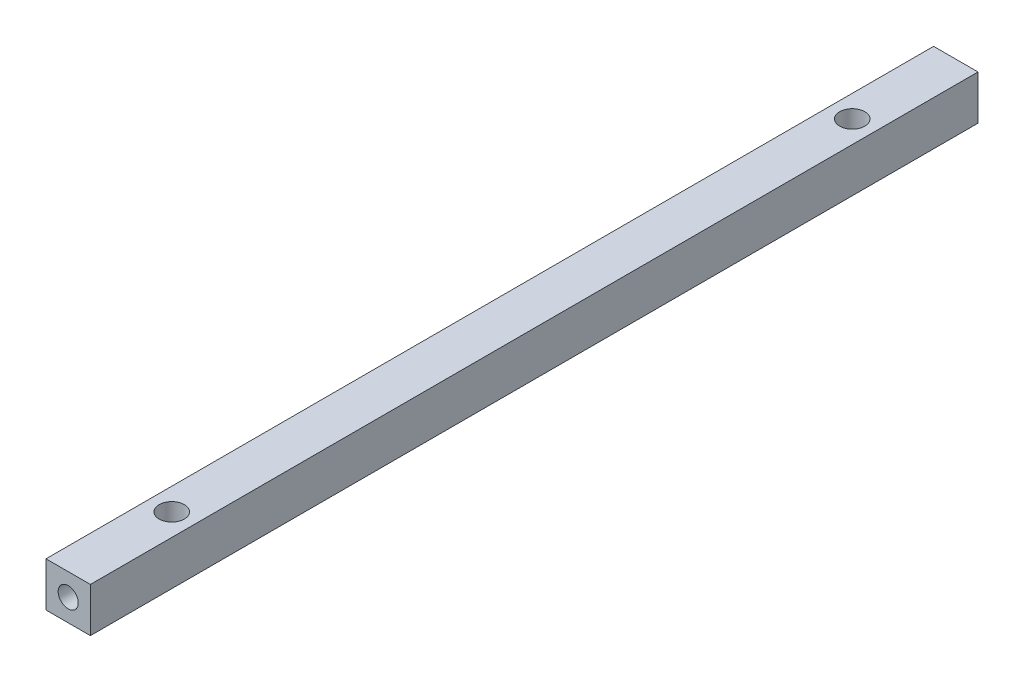
ISO-10303-21;
HEADER;
FILE_DESCRIPTION(('STEP AP214'),'2;1');
FILE_NAME('part.step','',(''),(''),'','','');
FILE_SCHEMA(('AUTOMOTIVE_DESIGN { 1 0 10303 214 1 1 1 1 }'));
ENDSEC;
DATA;
#1=APPLICATION_CONTEXT('core data for automotive mechanical design processes');
#2=APPLICATION_PROTOCOL_DEFINITION('international standard','automotive_design',2000,#1);
#3=PRODUCT_CONTEXT('',#1,'mechanical');
#4=PRODUCT('Part','Part','',(#3));
#5=PRODUCT_RELATED_PRODUCT_CATEGORY('part','',(#4));
#6=PRODUCT_DEFINITION_FORMATION('','',#4);
#7=PRODUCT_DEFINITION_CONTEXT('part definition',#1,'design');
#8=PRODUCT_DEFINITION('design','',#6,#7);
#9=PRODUCT_DEFINITION_SHAPE('','',#8);
#10=(LENGTH_UNIT() NAMED_UNIT(*) SI_UNIT(.MILLI.,.METRE.));
#11=(NAMED_UNIT(*) PLANE_ANGLE_UNIT() SI_UNIT($,.RADIAN.));
#12=(NAMED_UNIT(*) SI_UNIT($,.STERADIAN.) SOLID_ANGLE_UNIT());
#13=UNCERTAINTY_MEASURE_WITH_UNIT(LENGTH_MEASURE(1.E-05),#10,'distance_accuracy_value','');
#14=(GEOMETRIC_REPRESENTATION_CONTEXT(3) GLOBAL_UNCERTAINTY_ASSIGNED_CONTEXT((#13)) GLOBAL_UNIT_ASSIGNED_CONTEXT((#10,
#11,#12)) REPRESENTATION_CONTEXT('',''));
#15=CARTESIAN_POINT('',(0.,0.,0.));
#16=DIRECTION('',(0.,0.,1.));
#17=DIRECTION('',(1.,0.,0.));
#18=AXIS2_PLACEMENT_3D('',#15,#16,#17);
#19=CARTESIAN_POINT('',(7.5,-7.5,150.));
#20=DIRECTION('',(-1.,0.,0.));
#21=DIRECTION('',(0.,0.,1.));
#22=AXIS2_PLACEMENT_3D('',#19,#20,#21);
#23=PLANE('',#22);
#24=DIRECTION('',(0.,1.,0.));
#25=VECTOR('',#24,1.);
#26=CARTESIAN_POINT('',(7.5,-7.5,-150.));
#27=LINE('',#26,#25);
#28=CARTESIAN_POINT('',(7.5,-7.5,-150.));
#29=VERTEX_POINT('',#28);
#30=CARTESIAN_POINT('',(7.5,7.5,-150.));
#31=VERTEX_POINT('',#30);
#32=EDGE_CURVE('E126',#29,#31,#27,.T.);
#33=ORIENTED_EDGE('',*,*,#32,.T.);
#34=DIRECTION('',(0.,0.,-1.));
#35=VECTOR('',#34,1.);
#36=CARTESIAN_POINT('',(7.5,7.5,150.));
#37=LINE('',#36,#35);
#38=CARTESIAN_POINT('',(7.5,7.5,150.));
#39=VERTEX_POINT('',#38);
#40=EDGE_CURVE('E11',#39,#31,#37,.T.);
#41=ORIENTED_EDGE('',*,*,#40,.F.);
#42=DIRECTION('',(0.,1.,0.));
#43=VECTOR('',#42,1.);
#44=CARTESIAN_POINT('',(7.5,-7.5,150.));
#45=LINE('',#44,#43);
#46=CARTESIAN_POINT('',(7.5,-7.5,150.));
#47=VERTEX_POINT('',#46);
#48=EDGE_CURVE('E127',#47,#39,#45,.T.);
#49=ORIENTED_EDGE('',*,*,#48,.F.);
#50=DIRECTION('',(0.,0.,-1.));
#51=VECTOR('',#50,1.);
#52=CARTESIAN_POINT('',(7.5,-7.5,150.));
#53=LINE('',#52,#51);
#54=EDGE_CURVE('E137',#47,#29,#53,.T.);
#55=ORIENTED_EDGE('',*,*,#54,.T.);
#56=EDGE_LOOP('',(#33,#41,#49,#55));
#57=FACE_BOUND('',#56,.T.);
#58=ADVANCED_FACE('F44',(#57),#23,.F.);
#59=CARTESIAN_POINT('',(-7.5,7.5,150.));
#60=DIRECTION('',(0.,-1.,0.));
#61=DIRECTION('',(0.,0.,-1.));
#62=AXIS2_PLACEMENT_3D('',#59,#60,#61);
#63=PLANE('',#62);
#64=CARTESIAN_POINT('',(0.,7.5,-115.));
#65=DIRECTION('',(0.,-1.,0.));
#66=DIRECTION('',(0.,0.,-1.));
#67=AXIS2_PLACEMENT_3D('',#64,#65,#66);
#68=CIRCLE('',#67,4.25000000000001);
#69=CARTESIAN_POINT('',(0.,7.5,-119.25));
#70=VERTEX_POINT('',#69);
#71=EDGE_CURVE('E189',#70,#70,#68,.T.);
#72=ORIENTED_EDGE('',*,*,#71,.T.);
#73=EDGE_LOOP('',(#72));
#74=FACE_BOUND('',#73,.T.);
#75=CARTESIAN_POINT('',(0.,7.5,115.));
#76=DIRECTION('',(0.,-1.,0.));
#77=DIRECTION('',(0.,0.,-1.));
#78=AXIS2_PLACEMENT_3D('',#75,#76,#77);
#79=CIRCLE('',#78,4.25000000000001);
#80=CARTESIAN_POINT('',(0.,7.5,110.75));
#81=VERTEX_POINT('',#80);
#82=EDGE_CURVE('E119',#81,#81,#79,.T.);
#83=ORIENTED_EDGE('',*,*,#82,.T.);
#84=EDGE_LOOP('',(#83));
#85=FACE_BOUND('',#84,.T.);
#86=DIRECTION('',(-1.,0.,0.));
#87=VECTOR('',#86,1.);
#88=CARTESIAN_POINT('',(-7.5,7.5,-150.));
#89=LINE('',#88,#87);
#90=CARTESIAN_POINT('',(-7.5,7.5,-150.));
#91=VERTEX_POINT('',#90);
#92=EDGE_CURVE('E141',#31,#91,#89,.T.);
#93=ORIENTED_EDGE('',*,*,#92,.T.);
#94=DIRECTION('',(0.,0.,-1.));
#95=VECTOR('',#94,1.);
#96=CARTESIAN_POINT('',(-7.5,7.5,150.));
#97=LINE('',#96,#95);
#98=CARTESIAN_POINT('',(-7.5,7.5,150.));
#99=VERTEX_POINT('',#98);
#100=EDGE_CURVE('E53',#99,#91,#97,.T.);
#101=ORIENTED_EDGE('',*,*,#100,.F.);
#102=DIRECTION('',(-1.,0.,0.));
#103=VECTOR('',#102,1.);
#104=CARTESIAN_POINT('',(-7.5,7.5,150.));
#105=LINE('',#104,#103);
#106=EDGE_CURVE('E92',#39,#99,#105,.T.);
#107=ORIENTED_EDGE('',*,*,#106,.F.);
#108=ORIENTED_EDGE('',*,*,#40,.T.);
#109=EDGE_LOOP('',(#93,#101,#107,#108));
#110=FACE_BOUND('',#109,.T.);
#111=ADVANCED_FACE('F174',(#74,#85,#110),#63,.F.);
#112=CARTESIAN_POINT('',(-7.5,-7.5,150.));
#113=DIRECTION('',(1.,0.,0.));
#114=DIRECTION('',(0.,0.,-1.));
#115=AXIS2_PLACEMENT_3D('',#112,#113,#114);
#116=PLANE('',#115);
#117=DIRECTION('',(0.,-1.,0.));
#118=VECTOR('',#117,1.);
#119=CARTESIAN_POINT('',(-7.5,-7.5,-150.));
#120=LINE('',#119,#118);
#121=CARTESIAN_POINT('',(-7.5,-7.5,-150.));
#122=VERTEX_POINT('',#121);
#123=EDGE_CURVE('E79',#91,#122,#120,.T.);
#124=ORIENTED_EDGE('',*,*,#123,.T.);
#125=DIRECTION('',(0.,0.,-1.));
#126=VECTOR('',#125,1.);
#127=CARTESIAN_POINT('',(-7.5,-7.5,150.));
#128=LINE('',#127,#126);
#129=CARTESIAN_POINT('',(-7.5,-7.5,150.));
#130=VERTEX_POINT('',#129);
#131=EDGE_CURVE('E150',#130,#122,#128,.T.);
#132=ORIENTED_EDGE('',*,*,#131,.F.);
#133=DIRECTION('',(0.,-1.,0.));
#134=VECTOR('',#133,1.);
#135=CARTESIAN_POINT('',(-7.5,-7.5,150.));
#136=LINE('',#135,#134);
#137=EDGE_CURVE('E132',#99,#130,#136,.T.);
#138=ORIENTED_EDGE('',*,*,#137,.F.);
#139=ORIENTED_EDGE('',*,*,#100,.T.);
#140=EDGE_LOOP('',(#124,#132,#138,#139));
#141=FACE_BOUND('',#140,.T.);
#142=ADVANCED_FACE('F154',(#141),#116,.F.);
#143=CARTESIAN_POINT('',(-7.5,-7.5,150.));
#144=DIRECTION('',(0.,1.,0.));
#145=DIRECTION('',(0.,0.,1.));
#146=AXIS2_PLACEMENT_3D('',#143,#144,#145);
#147=PLANE('',#146);
#148=CARTESIAN_POINT('',(0.,-7.5,-115.));
#149=DIRECTION('',(0.,-1.,0.));
#150=DIRECTION('',(0.,0.,-1.));
#151=AXIS2_PLACEMENT_3D('',#148,#149,#150);
#152=CIRCLE('',#151,7.00000000000001);
#153=CARTESIAN_POINT('',(0.,-7.5,-122.));
#154=VERTEX_POINT('',#153);
#155=EDGE_CURVE('E217',#154,#154,#152,.T.);
#156=ORIENTED_EDGE('',*,*,#155,.F.);
#157=EDGE_LOOP('',(#156));
#158=FACE_BOUND('',#157,.T.);
#159=CARTESIAN_POINT('',(0.,-7.5,115.));
#160=DIRECTION('',(0.,-1.,0.));
#161=DIRECTION('',(0.,0.,-1.));
#162=AXIS2_PLACEMENT_3D('',#159,#160,#161);
#163=CIRCLE('',#162,7.00000000000001);
#164=CARTESIAN_POINT('',(0.,-7.5,108.));
#165=VERTEX_POINT('',#164);
#166=EDGE_CURVE('E203',#165,#165,#163,.T.);
#167=ORIENTED_EDGE('',*,*,#166,.F.);
#168=EDGE_LOOP('',(#167));
#169=FACE_BOUND('',#168,.T.);
#170=DIRECTION('',(1.,0.,0.));
#171=VECTOR('',#170,1.);
#172=CARTESIAN_POINT('',(-7.5,-7.5,-150.));
#173=LINE('',#172,#171);
#174=EDGE_CURVE('E85',#122,#29,#173,.T.);
#175=ORIENTED_EDGE('',*,*,#174,.T.);
#176=ORIENTED_EDGE('',*,*,#54,.F.);
#177=DIRECTION('',(1.,0.,0.));
#178=VECTOR('',#177,1.);
#179=CARTESIAN_POINT('',(-7.5,-7.5,150.));
#180=LINE('',#179,#178);
#181=EDGE_CURVE('E61',#130,#47,#180,.T.);
#182=ORIENTED_EDGE('',*,*,#181,.F.);
#183=ORIENTED_EDGE('',*,*,#131,.T.);
#184=EDGE_LOOP('',(#175,#176,#182,#183));
#185=FACE_BOUND('',#184,.T.);
#186=ADVANCED_FACE('F161',(#158,#169,#185),#147,.F.);
#187=CARTESIAN_POINT('',(0.,0.,150.));
#188=DIRECTION('',(0.,0.,-1.));
#189=DIRECTION('',(-1.,0.,0.));
#190=AXIS2_PLACEMENT_3D('',#187,#188,#189);
#191=PLANE('',#190);
#192=CARTESIAN_POINT('',(0.,0.,150.));
#193=DIRECTION('',(0.,0.,1.));
#194=DIRECTION('',(1.,0.,0.));
#195=AXIS2_PLACEMENT_3D('',#192,#193,#194);
#196=CIRCLE('',#195,3.39999999999999);
#197=CARTESIAN_POINT('',(3.39999999999999,0.,150.));
#198=VERTEX_POINT('',#197);
#199=EDGE_CURVE('E110',#198,#198,#196,.T.);
#200=ORIENTED_EDGE('',*,*,#199,.F.);
#201=EDGE_LOOP('',(#200));
#202=FACE_BOUND('',#201,.T.);
#203=ORIENTED_EDGE('',*,*,#48,.T.);
#204=ORIENTED_EDGE('',*,*,#106,.T.);
#205=ORIENTED_EDGE('',*,*,#137,.T.);
#206=ORIENTED_EDGE('',*,*,#181,.T.);
#207=EDGE_LOOP('',(#203,#204,#205,#206));
#208=FACE_BOUND('',#207,.T.);
#209=ADVANCED_FACE('F163',(#202,#208),#191,.F.);
#210=CARTESIAN_POINT('',(0.,0.,-150.));
#211=DIRECTION('',(0.,0.,-1.));
#212=DIRECTION('',(-1.,0.,0.));
#213=AXIS2_PLACEMENT_3D('',#210,#211,#212);
#214=PLANE('',#213);
#215=CARTESIAN_POINT('',(0.,0.,-150.));
#216=DIRECTION('',(0.,0.,-1.));
#217=DIRECTION('',(-1.,0.,0.));
#218=AXIS2_PLACEMENT_3D('',#215,#216,#217);
#219=CIRCLE('',#218,3.39999999999999);
#220=CARTESIAN_POINT('',(-3.39999999999999,0.,-150.));
#221=VERTEX_POINT('',#220);
#222=EDGE_CURVE('E111',#221,#221,#219,.T.);
#223=ORIENTED_EDGE('',*,*,#222,.F.);
#224=EDGE_LOOP('',(#223));
#225=FACE_BOUND('',#224,.T.);
#226=ORIENTED_EDGE('',*,*,#32,.F.);
#227=ORIENTED_EDGE('',*,*,#174,.F.);
#228=ORIENTED_EDGE('',*,*,#123,.F.);
#229=ORIENTED_EDGE('',*,*,#92,.F.);
#230=EDGE_LOOP('',(#226,#227,#228,#229));
#231=FACE_BOUND('',#230,.T.);
#232=ADVANCED_FACE('F157',(#225,#231),#214,.T.);
#233=CARTESIAN_POINT('',(0.,0.,127.75));
#234=DIRECTION('',(0.,0.,1.));
#235=DIRECTION('',(1.,0.,0.));
#236=AXIS2_PLACEMENT_3D('',#233,#234,#235);
#237=CONICAL_SURFACE('',#236,3.39999999999999,1.02974425867665);
#238=CARTESIAN_POINT('',(0.,0.,125.707073895306));
#239=VERTEX_POINT('',#238);
#240=VERTEX_LOOP('',#239);
#241=FACE_BOUND('',#240,.T.);
#242=CARTESIAN_POINT('',(0.,0.,127.75));
#243=DIRECTION('',(0.,0.,1.));
#244=DIRECTION('',(1.,0.,0.));
#245=AXIS2_PLACEMENT_3D('',#242,#243,#244);
#246=CIRCLE('',#245,3.39999999999999);
#247=CARTESIAN_POINT('',(3.39999999999999,0.,127.75));
#248=VERTEX_POINT('',#247);
#249=EDGE_CURVE('E116',#248,#248,#246,.T.);
#250=ORIENTED_EDGE('',*,*,#249,.T.);
#251=EDGE_LOOP('',(#250));
#252=FACE_BOUND('',#251,.T.);
#253=ADVANCED_FACE('F252',(#241,#252),#237,.F.);
#254=CARTESIAN_POINT('',(0.,0.,150.));
#255=DIRECTION('',(0.,0.,1.));
#256=DIRECTION('',(1.,0.,0.));
#257=AXIS2_PLACEMENT_3D('',#254,#255,#256);
#258=CYLINDRICAL_SURFACE('',#257,3.39999999999999);
#259=ORIENTED_EDGE('',*,*,#249,.F.);
#260=EDGE_LOOP('',(#259));
#261=FACE_BOUND('',#260,.T.);
#262=ORIENTED_EDGE('',*,*,#199,.T.);
#263=EDGE_LOOP('',(#262));
#264=FACE_BOUND('',#263,.T.);
#265=ADVANCED_FACE('F103',(#261,#264),#258,.F.);
#266=CARTESIAN_POINT('',(0.,0.,-127.75));
#267=DIRECTION('',(0.,0.,-1.));
#268=DIRECTION('',(-1.,0.,0.));
#269=AXIS2_PLACEMENT_3D('',#266,#267,#268);
#270=CONICAL_SURFACE('',#269,3.39999999999999,1.02974425867665);
#271=CARTESIAN_POINT('',(0.,0.,-125.707073895306));
#272=VERTEX_POINT('',#271);
#273=VERTEX_LOOP('',#272);
#274=FACE_BOUND('',#273,.T.);
#275=CARTESIAN_POINT('',(0.,0.,-127.75));
#276=DIRECTION('',(0.,0.,-1.));
#277=DIRECTION('',(-1.,0.,0.));
#278=AXIS2_PLACEMENT_3D('',#275,#276,#277);
#279=CIRCLE('',#278,3.39999999999999);
#280=CARTESIAN_POINT('',(-3.39999999999999,0.,-127.75));
#281=VERTEX_POINT('',#280);
#282=EDGE_CURVE('E107',#281,#281,#279,.T.);
#283=ORIENTED_EDGE('',*,*,#282,.T.);
#284=EDGE_LOOP('',(#283));
#285=FACE_BOUND('',#284,.T.);
#286=ADVANCED_FACE('F99',(#274,#285),#270,.F.);
#287=CARTESIAN_POINT('',(0.,0.,-150.));
#288=DIRECTION('',(0.,0.,-1.));
#289=DIRECTION('',(-1.,0.,0.));
#290=AXIS2_PLACEMENT_3D('',#287,#288,#289);
#291=CYLINDRICAL_SURFACE('',#290,3.39999999999999);
#292=ORIENTED_EDGE('',*,*,#282,.F.);
#293=EDGE_LOOP('',(#292));
#294=FACE_BOUND('',#293,.T.);
#295=ORIENTED_EDGE('',*,*,#222,.T.);
#296=EDGE_LOOP('',(#295));
#297=FACE_BOUND('',#296,.T.);
#298=ADVANCED_FACE('F102',(#294,#297),#291,.F.);
#299=CARTESIAN_POINT('',(0.,-7.5,115.));
#300=DIRECTION('',(0.,-1.,0.));
#301=DIRECTION('',(0.,0.,-1.));
#302=AXIS2_PLACEMENT_3D('',#299,#300,#301);
#303=CYLINDRICAL_SURFACE('',#302,4.25000000000001);
#304=ORIENTED_EDGE('',*,*,#82,.F.);
#305=EDGE_LOOP('',(#304));
#306=FACE_BOUND('',#305,.T.);
#307=CARTESIAN_POINT('',(0.,0.5,115.));
#308=DIRECTION('',(0.,-1.,0.));
#309=DIRECTION('',(0.,0.,-1.));
#310=AXIS2_PLACEMENT_3D('',#307,#308,#309);
#311=CIRCLE('',#310,4.25000000000001);
#312=CARTESIAN_POINT('',(0.,0.5,110.75));
#313=VERTEX_POINT('',#312);
#314=EDGE_CURVE('E194',#313,#313,#311,.T.);
#315=ORIENTED_EDGE('',*,*,#314,.T.);
#316=EDGE_LOOP('',(#315));
#317=FACE_BOUND('',#316,.T.);
#318=ADVANCED_FACE('F244',(#306,#317),#303,.F.);
#319=CARTESIAN_POINT('',(4.25000000000001,0.5,115.));
#320=DIRECTION('',(0.,1.,0.));
#321=DIRECTION('',(0.,0.,1.));
#322=AXIS2_PLACEMENT_3D('',#319,#320,#321);
#323=PLANE('',#322);
#324=ORIENTED_EDGE('',*,*,#314,.F.);
#325=EDGE_LOOP('',(#324));
#326=FACE_BOUND('',#325,.T.);
#327=CARTESIAN_POINT('',(0.,0.5,115.));
#328=DIRECTION('',(0.,-1.,0.));
#329=DIRECTION('',(0.,0.,-1.));
#330=AXIS2_PLACEMENT_3D('',#327,#328,#329);
#331=CIRCLE('',#330,7.00000000000001);
#332=CARTESIAN_POINT('',(0.,0.5,108.));
#333=VERTEX_POINT('',#332);
#334=EDGE_CURVE('E197',#333,#333,#331,.T.);
#335=ORIENTED_EDGE('',*,*,#334,.T.);
#336=EDGE_LOOP('',(#335));
#337=FACE_BOUND('',#336,.T.);
#338=ADVANCED_FACE('F240',(#326,#337),#323,.F.);
#339=CARTESIAN_POINT('',(0.,-7.5,115.));
#340=DIRECTION('',(0.,-1.,0.));
#341=DIRECTION('',(0.,0.,-1.));
#342=AXIS2_PLACEMENT_3D('',#339,#340,#341);
#343=CYLINDRICAL_SURFACE('',#342,7.00000000000001);
#344=ORIENTED_EDGE('',*,*,#334,.F.);
#345=EDGE_LOOP('',(#344));
#346=FACE_BOUND('',#345,.T.);
#347=ORIENTED_EDGE('',*,*,#166,.T.);
#348=EDGE_LOOP('',(#347));
#349=FACE_BOUND('',#348,.T.);
#350=ADVANCED_FACE('F236',(#346,#349),#343,.F.);
#351=CARTESIAN_POINT('',(0.,-7.5,-115.));
#352=DIRECTION('',(0.,-1.,0.));
#353=DIRECTION('',(0.,0.,-1.));
#354=AXIS2_PLACEMENT_3D('',#351,#352,#353);
#355=CYLINDRICAL_SURFACE('',#354,4.25000000000001);
#356=ORIENTED_EDGE('',*,*,#71,.F.);
#357=EDGE_LOOP('',(#356));
#358=FACE_BOUND('',#357,.T.);
#359=CARTESIAN_POINT('',(0.,0.5,-115.));
#360=DIRECTION('',(0.,-1.,0.));
#361=DIRECTION('',(0.,0.,-1.));
#362=AXIS2_PLACEMENT_3D('',#359,#360,#361);
#363=CIRCLE('',#362,4.25000000000001);
#364=CARTESIAN_POINT('',(0.,0.5,-119.25));
#365=VERTEX_POINT('',#364);
#366=EDGE_CURVE('E209',#365,#365,#363,.T.);
#367=ORIENTED_EDGE('',*,*,#366,.T.);
#368=EDGE_LOOP('',(#367));
#369=FACE_BOUND('',#368,.T.);
#370=ADVANCED_FACE('F229',(#358,#369),#355,.F.);
#371=CARTESIAN_POINT('',(4.25000000000001,0.5,-115.));
#372=DIRECTION('',(0.,1.,0.));
#373=DIRECTION('',(0.,0.,1.));
#374=AXIS2_PLACEMENT_3D('',#371,#372,#373);
#375=PLANE('',#374);
#376=ORIENTED_EDGE('',*,*,#366,.F.);
#377=EDGE_LOOP('',(#376));
#378=FACE_BOUND('',#377,.T.);
#379=CARTESIAN_POINT('',(0.,0.5,-115.));
#380=DIRECTION('',(0.,-1.,0.));
#381=DIRECTION('',(0.,0.,-1.));
#382=AXIS2_PLACEMENT_3D('',#379,#380,#381);
#383=CIRCLE('',#382,7.00000000000001);
#384=CARTESIAN_POINT('',(0.,0.5,-122.));
#385=VERTEX_POINT('',#384);
#386=EDGE_CURVE('E213',#385,#385,#383,.T.);
#387=ORIENTED_EDGE('',*,*,#386,.T.);
#388=EDGE_LOOP('',(#387));
#389=FACE_BOUND('',#388,.T.);
#390=ADVANCED_FACE('F223',(#378,#389),#375,.F.);
#391=CARTESIAN_POINT('',(0.,-7.5,-115.));
#392=DIRECTION('',(0.,-1.,0.));
#393=DIRECTION('',(0.,0.,-1.));
#394=AXIS2_PLACEMENT_3D('',#391,#392,#393);
#395=CYLINDRICAL_SURFACE('',#394,7.00000000000001);
#396=ORIENTED_EDGE('',*,*,#386,.F.);
#397=EDGE_LOOP('',(#396));
#398=FACE_BOUND('',#397,.T.);
#399=ORIENTED_EDGE('',*,*,#155,.T.);
#400=EDGE_LOOP('',(#399));
#401=FACE_BOUND('',#400,.T.);
#402=ADVANCED_FACE('F221',(#398,#401),#395,.F.);
#403=CLOSED_SHELL('',(#58,#111,#142,#186,#209,#232,#253,#265,#286,#298,#318,#338,#350,#370,#390,#402));
#404=MANIFOLD_SOLID_BREP('B2',#403);
#405=ADVANCED_BREP_SHAPE_REPRESENTATION('',(#18,#404),#14);
#406=SHAPE_DEFINITION_REPRESENTATION(#9,#405);
ENDSEC;
END-ISO-10303-21;
